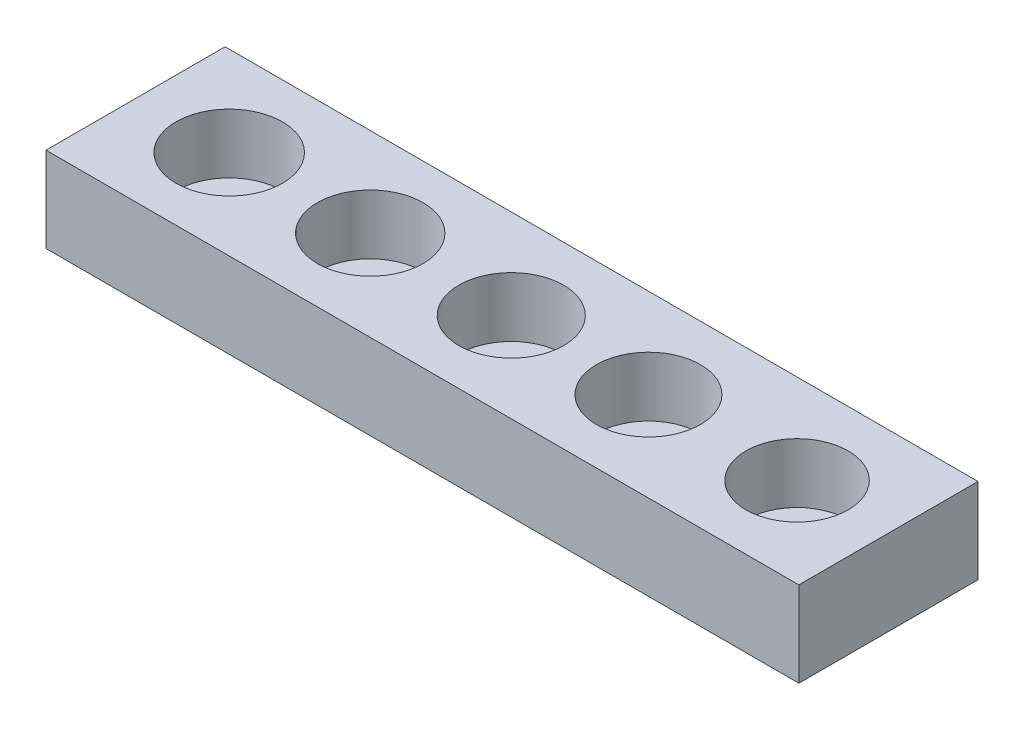
ISO-10303-21;
HEADER;
FILE_DESCRIPTION(('STEP AP214'),'2;1');
FILE_NAME('part.step','',(''),(''),'','','');
FILE_SCHEMA(('AUTOMOTIVE_DESIGN { 1 0 10303 214 1 1 1 1 }'));
ENDSEC;
DATA;
#1=APPLICATION_CONTEXT('core data for automotive mechanical design processes');
#2=APPLICATION_PROTOCOL_DEFINITION('international standard','automotive_design',2000,#1);
#3=PRODUCT_CONTEXT('',#1,'mechanical');
#4=PRODUCT('Part','Part','',(#3));
#5=PRODUCT_RELATED_PRODUCT_CATEGORY('part','',(#4));
#6=PRODUCT_DEFINITION_FORMATION('','',#4);
#7=PRODUCT_DEFINITION_CONTEXT('part definition',#1,'design');
#8=PRODUCT_DEFINITION('design','',#6,#7);
#9=PRODUCT_DEFINITION_SHAPE('','',#8);
#10=(LENGTH_UNIT() NAMED_UNIT(*) SI_UNIT(.MILLI.,.METRE.));
#11=(NAMED_UNIT(*) PLANE_ANGLE_UNIT() SI_UNIT($,.RADIAN.));
#12=(NAMED_UNIT(*) SI_UNIT($,.STERADIAN.) SOLID_ANGLE_UNIT());
#13=UNCERTAINTY_MEASURE_WITH_UNIT(LENGTH_MEASURE(1.E-05),#10,'distance_accuracy_value','');
#14=(GEOMETRIC_REPRESENTATION_CONTEXT(3) GLOBAL_UNCERTAINTY_ASSIGNED_CONTEXT((#13)) GLOBAL_UNIT_ASSIGNED_CONTEXT((#10,
#11,#12)) REPRESENTATION_CONTEXT('',''));
#15=CARTESIAN_POINT('',(0.,0.,0.));
#16=DIRECTION('',(0.,0.,1.));
#17=DIRECTION('',(1.,0.,0.));
#18=AXIS2_PLACEMENT_3D('',#15,#16,#17);
#19=CARTESIAN_POINT('',(-22.0918953244975,5.,-5.25584062481323));
#20=DIRECTION('',(0.,0.,-1.));
#21=DIRECTION('',(-1.,0.,0.));
#22=AXIS2_PLACEMENT_3D('',#19,#20,#21);
#23=PLANE('',#22);
#24=DIRECTION('',(1.,0.,0.));
#25=VECTOR('',#24,1.);
#26=CARTESIAN_POINT('',(-22.0918953244975,0.,-5.25584062481323));
#27=LINE('',#26,#25);
#28=CARTESIAN_POINT('',(-22.0918953244975,0.,-5.25584062481323));
#29=VERTEX_POINT('',#28);
#30=CARTESIAN_POINT('',(22.0918953244975,0.,-5.25584062481323));
#31=VERTEX_POINT('',#30);
#32=EDGE_CURVE('E116',#29,#31,#27,.T.);
#33=ORIENTED_EDGE('',*,*,#32,.F.);
#34=DIRECTION('',(0.,-1.,0.));
#35=VECTOR('',#34,1.);
#36=CARTESIAN_POINT('',(-22.0918953244975,5.,-5.25584062481323));
#37=LINE('',#36,#35);
#38=CARTESIAN_POINT('',(-22.0918953244975,5.,-5.25584062481323));
#39=VERTEX_POINT('',#38);
#40=EDGE_CURVE('E11',#39,#29,#37,.T.);
#41=ORIENTED_EDGE('',*,*,#40,.F.);
#42=DIRECTION('',(1.,0.,0.));
#43=VECTOR('',#42,1.);
#44=CARTESIAN_POINT('',(-22.0918953244975,5.,-5.25584062481323));
#45=LINE('',#44,#43);
#46=CARTESIAN_POINT('',(22.0918953244975,5.,-5.25584062481323));
#47=VERTEX_POINT('',#46);
#48=EDGE_CURVE('E107',#39,#47,#45,.T.);
#49=ORIENTED_EDGE('',*,*,#48,.T.);
#50=DIRECTION('',(0.,-1.,0.));
#51=VECTOR('',#50,1.);
#52=CARTESIAN_POINT('',(22.0918953244975,5.,-5.25584062481323));
#53=LINE('',#52,#51);
#54=EDGE_CURVE('E48',#47,#31,#53,.T.);
#55=ORIENTED_EDGE('',*,*,#54,.T.);
#56=EDGE_LOOP('',(#33,#41,#49,#55));
#57=FACE_BOUND('',#56,.T.);
#58=ADVANCED_FACE('F45',(#57),#23,.T.);
#59=CARTESIAN_POINT('',(-22.0918953244975,5.,5.25584062481323));
#60=DIRECTION('',(-1.,0.,0.));
#61=DIRECTION('',(0.,0.,1.));
#62=AXIS2_PLACEMENT_3D('',#59,#60,#61);
#63=PLANE('',#62);
#64=DIRECTION('',(0.,0.,-1.));
#65=VECTOR('',#64,1.);
#66=CARTESIAN_POINT('',(-22.0918953244975,0.,5.25584062481323));
#67=LINE('',#66,#65);
#68=CARTESIAN_POINT('',(-22.0918953244975,0.,5.25584062481323));
#69=VERTEX_POINT('',#68);
#70=EDGE_CURVE('E110',#69,#29,#67,.T.);
#71=ORIENTED_EDGE('',*,*,#70,.F.);
#72=DIRECTION('',(0.,-1.,0.));
#73=VECTOR('',#72,1.);
#74=CARTESIAN_POINT('',(-22.0918953244975,5.,5.25584062481323));
#75=LINE('',#74,#73);
#76=CARTESIAN_POINT('',(-22.0918953244975,5.,5.25584062481323));
#77=VERTEX_POINT('',#76);
#78=EDGE_CURVE('E55',#77,#69,#75,.T.);
#79=ORIENTED_EDGE('',*,*,#78,.F.);
#80=DIRECTION('',(0.,0.,-1.));
#81=VECTOR('',#80,1.);
#82=CARTESIAN_POINT('',(-22.0918953244975,5.,5.25584062481323));
#83=LINE('',#82,#81);
#84=EDGE_CURVE('E94',#77,#39,#83,.T.);
#85=ORIENTED_EDGE('',*,*,#84,.T.);
#86=ORIENTED_EDGE('',*,*,#40,.T.);
#87=EDGE_LOOP('',(#71,#79,#85,#86));
#88=FACE_BOUND('',#87,.T.);
#89=ADVANCED_FACE('F133',(#88),#63,.T.);
#90=CARTESIAN_POINT('',(-22.0918953244975,5.,5.25584062481323));
#91=DIRECTION('',(0.,0.,-1.));
#92=DIRECTION('',(-1.,0.,0.));
#93=AXIS2_PLACEMENT_3D('',#90,#91,#92);
#94=PLANE('',#93);
#95=DIRECTION('',(1.,0.,0.));
#96=VECTOR('',#95,1.);
#97=CARTESIAN_POINT('',(-22.0918953244975,0.,5.25584062481323));
#98=LINE('',#97,#96);
#99=CARTESIAN_POINT('',(22.0918953244975,0.,5.25584062481323));
#100=VERTEX_POINT('',#99);
#101=EDGE_CURVE('E100',#69,#100,#98,.T.);
#102=ORIENTED_EDGE('',*,*,#101,.T.);
#103=DIRECTION('',(0.,-1.,0.));
#104=VECTOR('',#103,1.);
#105=CARTESIAN_POINT('',(22.0918953244975,5.,5.25584062481323));
#106=LINE('',#105,#104);
#107=CARTESIAN_POINT('',(22.0918953244975,5.,5.25584062481323));
#108=VERTEX_POINT('',#107);
#109=EDGE_CURVE('E98',#108,#100,#106,.T.);
#110=ORIENTED_EDGE('',*,*,#109,.F.);
#111=DIRECTION('',(1.,0.,0.));
#112=VECTOR('',#111,1.);
#113=CARTESIAN_POINT('',(-22.0918953244975,5.,5.25584062481323));
#114=LINE('',#113,#112);
#115=EDGE_CURVE('E91',#77,#108,#114,.T.);
#116=ORIENTED_EDGE('',*,*,#115,.F.);
#117=ORIENTED_EDGE('',*,*,#78,.T.);
#118=EDGE_LOOP('',(#102,#110,#116,#117));
#119=FACE_BOUND('',#118,.T.);
#120=ADVANCED_FACE('F99',(#119),#94,.F.);
#121=CARTESIAN_POINT('',(22.0918953244975,5.,5.25584062481323));
#122=DIRECTION('',(-1.,0.,0.));
#123=DIRECTION('',(0.,0.,1.));
#124=AXIS2_PLACEMENT_3D('',#121,#122,#123);
#125=PLANE('',#124);
#126=DIRECTION('',(0.,0.,-1.));
#127=VECTOR('',#126,1.);
#128=CARTESIAN_POINT('',(22.0918953244975,0.,5.25584062481323));
#129=LINE('',#128,#127);
#130=EDGE_CURVE('E120',#100,#31,#129,.T.);
#131=ORIENTED_EDGE('',*,*,#130,.T.);
#132=ORIENTED_EDGE('',*,*,#54,.F.);
#133=DIRECTION('',(0.,0.,-1.));
#134=VECTOR('',#133,1.);
#135=CARTESIAN_POINT('',(22.0918953244975,5.,5.25584062481323));
#136=LINE('',#135,#134);
#137=EDGE_CURVE('E88',#108,#47,#136,.T.);
#138=ORIENTED_EDGE('',*,*,#137,.F.);
#139=ORIENTED_EDGE('',*,*,#109,.T.);
#140=EDGE_LOOP('',(#131,#132,#138,#139));
#141=FACE_BOUND('',#140,.T.);
#142=ADVANCED_FACE('F105',(#141),#125,.F.);
#143=CARTESIAN_POINT('',(0.,5.,0.));
#144=DIRECTION('',(0.,1.,0.));
#145=DIRECTION('',(0.,0.,1.));
#146=AXIS2_PLACEMENT_3D('',#143,#144,#145);
#147=PLANE('',#146);
#148=CARTESIAN_POINT('',(-16.5953893403899,5.,0.));
#149=DIRECTION('',(0.,1.,0.));
#150=DIRECTION('',(0.,0.,1.));
#151=AXIS2_PLACEMENT_3D('',#148,#149,#150);
#152=CIRCLE('',#151,3.125);
#153=CARTESIAN_POINT('',(-16.5953893403899,5.,3.125));
#154=VERTEX_POINT('',#153);
#155=EDGE_CURVE('E198',#154,#154,#152,.T.);
#156=ORIENTED_EDGE('',*,*,#155,.F.);
#157=EDGE_LOOP('',(#156));
#158=FACE_BOUND('',#157,.T.);
#159=CARTESIAN_POINT('',(-8.36374721634367,5.,-0.0444880171082105));
#160=DIRECTION('',(0.,1.,0.));
#161=DIRECTION('',(0.,0.,1.));
#162=AXIS2_PLACEMENT_3D('',#159,#160,#161);
#163=CIRCLE('',#162,3.1);
#164=CARTESIAN_POINT('',(-8.36374721634367,5.,3.05551198289179));
#165=VERTEX_POINT('',#164);
#166=EDGE_CURVE('E202',#165,#165,#163,.T.);
#167=ORIENTED_EDGE('',*,*,#166,.F.);
#168=EDGE_LOOP('',(#167));
#169=FACE_BOUND('',#168,.T.);
#170=CARTESIAN_POINT('',(-0.044488017108206,5.,0.));
#171=DIRECTION('',(0.,1.,0.));
#172=DIRECTION('',(0.,0.,1.));
#173=AXIS2_PLACEMENT_3D('',#170,#171,#172);
#174=CIRCLE('',#173,3.075);
#175=CARTESIAN_POINT('',(-0.044488017108206,5.,3.075));
#176=VERTEX_POINT('',#175);
#177=EDGE_CURVE('E212',#176,#176,#174,.T.);
#178=ORIENTED_EDGE('',*,*,#177,.F.);
#179=EDGE_LOOP('',(#178));
#180=FACE_BOUND('',#179,.T.);
#181=CARTESIAN_POINT('',(8.00784307947799,5.,0.));
#182=DIRECTION('',(0.,1.,0.));
#183=DIRECTION('',(0.,0.,1.));
#184=AXIS2_PLACEMENT_3D('',#181,#182,#183);
#185=CIRCLE('',#184,3.05);
#186=CARTESIAN_POINT('',(8.00784307947799,5.,3.05));
#187=VERTEX_POINT('',#186);
#188=EDGE_CURVE('E220',#187,#187,#185,.T.);
#189=ORIENTED_EDGE('',*,*,#188,.F.);
#190=EDGE_LOOP('',(#189));
#191=FACE_BOUND('',#190,.T.);
#192=CARTESIAN_POINT('',(16.7274944326873,5.,0.));
#193=DIRECTION('',(0.,1.,0.));
#194=DIRECTION('',(0.,0.,1.));
#195=AXIS2_PLACEMENT_3D('',#192,#193,#194);
#196=CIRCLE('',#195,3.);
#197=CARTESIAN_POINT('',(16.7274944326873,5.,3.));
#198=VERTEX_POINT('',#197);
#199=EDGE_CURVE('E228',#198,#198,#196,.T.);
#200=ORIENTED_EDGE('',*,*,#199,.F.);
#201=EDGE_LOOP('',(#200));
#202=FACE_BOUND('',#201,.T.);
#203=ORIENTED_EDGE('',*,*,#48,.F.);
#204=ORIENTED_EDGE('',*,*,#84,.F.);
#205=ORIENTED_EDGE('',*,*,#115,.T.);
#206=ORIENTED_EDGE('',*,*,#137,.T.);
#207=EDGE_LOOP('',(#203,#204,#205,#206));
#208=FACE_BOUND('',#207,.T.);
#209=ADVANCED_FACE('F93',(#158,#169,#180,#191,#202,#208),#147,.T.);
#210=CARTESIAN_POINT('',(0.,0.,0.));
#211=DIRECTION('',(0.,1.,0.));
#212=DIRECTION('',(0.,0.,1.));
#213=AXIS2_PLACEMENT_3D('',#210,#211,#212);
#214=PLANE('',#213);
#215=ORIENTED_EDGE('',*,*,#32,.T.);
#216=ORIENTED_EDGE('',*,*,#130,.F.);
#217=ORIENTED_EDGE('',*,*,#101,.F.);
#218=ORIENTED_EDGE('',*,*,#70,.T.);
#219=EDGE_LOOP('',(#215,#216,#217,#218));
#220=FACE_BOUND('',#219,.T.);
#221=ADVANCED_FACE('F132',(#220),#214,.F.);
#222=CARTESIAN_POINT('',(16.7274944326873,1.5,0.));
#223=DIRECTION('',(0.,1.,0.));
#224=DIRECTION('',(0.,0.,1.));
#225=AXIS2_PLACEMENT_3D('',#222,#223,#224);
#226=CYLINDRICAL_SURFACE('',#225,3.);
#227=CARTESIAN_POINT('',(16.7274944326873,1.5,0.));
#228=DIRECTION('',(0.,1.,0.));
#229=DIRECTION('',(0.,0.,1.));
#230=AXIS2_PLACEMENT_3D('',#227,#228,#229);
#231=CIRCLE('',#230,3.);
#232=CARTESIAN_POINT('',(16.7274944326873,1.5,3.));
#233=VERTEX_POINT('',#232);
#234=EDGE_CURVE('E231',#233,#233,#231,.T.);
#235=ORIENTED_EDGE('',*,*,#234,.F.);
#236=EDGE_LOOP('',(#235));
#237=FACE_BOUND('',#236,.T.);
#238=ORIENTED_EDGE('',*,*,#199,.T.);
#239=EDGE_LOOP('',(#238));
#240=FACE_BOUND('',#239,.T.);
#241=ADVANCED_FACE('F152',(#237,#240),#226,.F.);
#242=CARTESIAN_POINT('',(16.7274944326873,1.5,0.));
#243=DIRECTION('',(0.,1.,0.));
#244=DIRECTION('',(0.,0.,1.));
#245=AXIS2_PLACEMENT_3D('',#242,#243,#244);
#246=PLANE('',#245);
#247=ORIENTED_EDGE('',*,*,#234,.T.);
#248=EDGE_LOOP('',(#247));
#249=FACE_BOUND('',#248,.T.);
#250=ADVANCED_FACE('F156',(#249),#246,.T.);
#251=CARTESIAN_POINT('',(8.00784307947799,1.5,0.));
#252=DIRECTION('',(0.,1.,0.));
#253=DIRECTION('',(0.,0.,1.));
#254=AXIS2_PLACEMENT_3D('',#251,#252,#253);
#255=CYLINDRICAL_SURFACE('',#254,3.05);
#256=CARTESIAN_POINT('',(8.00784307947799,1.5,0.));
#257=DIRECTION('',(0.,1.,0.));
#258=DIRECTION('',(0.,0.,1.));
#259=AXIS2_PLACEMENT_3D('',#256,#257,#258);
#260=CIRCLE('',#259,3.05);
#261=CARTESIAN_POINT('',(8.00784307947799,1.5,3.05));
#262=VERTEX_POINT('',#261);
#263=EDGE_CURVE('E224',#262,#262,#260,.T.);
#264=ORIENTED_EDGE('',*,*,#263,.F.);
#265=EDGE_LOOP('',(#264));
#266=FACE_BOUND('',#265,.T.);
#267=ORIENTED_EDGE('',*,*,#188,.T.);
#268=EDGE_LOOP('',(#267));
#269=FACE_BOUND('',#268,.T.);
#270=ADVANCED_FACE('F159',(#266,#269),#255,.F.);
#271=CARTESIAN_POINT('',(8.00784307947799,1.5,0.));
#272=DIRECTION('',(0.,1.,0.));
#273=DIRECTION('',(0.,0.,1.));
#274=AXIS2_PLACEMENT_3D('',#271,#272,#273);
#275=PLANE('',#274);
#276=ORIENTED_EDGE('',*,*,#263,.T.);
#277=EDGE_LOOP('',(#276));
#278=FACE_BOUND('',#277,.T.);
#279=ADVANCED_FACE('F163',(#278),#275,.T.);
#280=CARTESIAN_POINT('',(-0.044488017108206,1.5,0.));
#281=DIRECTION('',(0.,1.,0.));
#282=DIRECTION('',(0.,0.,1.));
#283=AXIS2_PLACEMENT_3D('',#280,#281,#282);
#284=CYLINDRICAL_SURFACE('',#283,3.075);
#285=CARTESIAN_POINT('',(-0.044488017108206,1.5,0.));
#286=DIRECTION('',(0.,1.,0.));
#287=DIRECTION('',(0.,0.,1.));
#288=AXIS2_PLACEMENT_3D('',#285,#286,#287);
#289=CIRCLE('',#288,3.075);
#290=CARTESIAN_POINT('',(-0.044488017108206,1.5,3.075));
#291=VERTEX_POINT('',#290);
#292=EDGE_CURVE('E216',#291,#291,#289,.T.);
#293=ORIENTED_EDGE('',*,*,#292,.F.);
#294=EDGE_LOOP('',(#293));
#295=FACE_BOUND('',#294,.T.);
#296=ORIENTED_EDGE('',*,*,#177,.T.);
#297=EDGE_LOOP('',(#296));
#298=FACE_BOUND('',#297,.T.);
#299=ADVANCED_FACE('F166',(#295,#298),#284,.F.);
#300=CARTESIAN_POINT('',(-0.044488017108206,1.5,0.));
#301=DIRECTION('',(0.,1.,0.));
#302=DIRECTION('',(0.,0.,1.));
#303=AXIS2_PLACEMENT_3D('',#300,#301,#302);
#304=PLANE('',#303);
#305=ORIENTED_EDGE('',*,*,#292,.T.);
#306=EDGE_LOOP('',(#305));
#307=FACE_BOUND('',#306,.T.);
#308=ADVANCED_FACE('F171',(#307),#304,.T.);
#309=CARTESIAN_POINT('',(-8.36374721634367,1.5,-0.0444880171082105));
#310=DIRECTION('',(0.,1.,0.));
#311=DIRECTION('',(0.,0.,1.));
#312=AXIS2_PLACEMENT_3D('',#309,#310,#311);
#313=CYLINDRICAL_SURFACE('',#312,3.1);
#314=CARTESIAN_POINT('',(-8.36374721634367,1.5,-0.0444880171082105));
#315=DIRECTION('',(0.,1.,0.));
#316=DIRECTION('',(0.,0.,1.));
#317=AXIS2_PLACEMENT_3D('',#314,#315,#316);
#318=CIRCLE('',#317,3.1);
#319=CARTESIAN_POINT('',(-8.36374721634367,1.5,3.05551198289179));
#320=VERTEX_POINT('',#319);
#321=EDGE_CURVE('E208',#320,#320,#318,.T.);
#322=ORIENTED_EDGE('',*,*,#321,.F.);
#323=EDGE_LOOP('',(#322));
#324=FACE_BOUND('',#323,.T.);
#325=ORIENTED_EDGE('',*,*,#166,.T.);
#326=EDGE_LOOP('',(#325));
#327=FACE_BOUND('',#326,.T.);
#328=ADVANCED_FACE('F174',(#324,#327),#313,.F.);
#329=CARTESIAN_POINT('',(-8.36374721634367,1.5,-0.0444880171082105));
#330=DIRECTION('',(0.,1.,0.));
#331=DIRECTION('',(0.,0.,1.));
#332=AXIS2_PLACEMENT_3D('',#329,#330,#331);
#333=PLANE('',#332);
#334=ORIENTED_EDGE('',*,*,#321,.T.);
#335=EDGE_LOOP('',(#334));
#336=FACE_BOUND('',#335,.T.);
#337=ADVANCED_FACE('F179',(#336),#333,.T.);
#338=CARTESIAN_POINT('',(-16.5953893403899,1.5,0.));
#339=DIRECTION('',(0.,1.,0.));
#340=DIRECTION('',(0.,0.,1.));
#341=AXIS2_PLACEMENT_3D('',#338,#339,#340);
#342=CYLINDRICAL_SURFACE('',#341,3.125);
#343=CARTESIAN_POINT('',(-16.5953893403899,1.5,0.));
#344=DIRECTION('',(0.,1.,0.));
#345=DIRECTION('',(0.,0.,1.));
#346=AXIS2_PLACEMENT_3D('',#343,#344,#345);
#347=CIRCLE('',#346,3.125);
#348=CARTESIAN_POINT('',(-16.5953893403899,1.5,3.125));
#349=VERTEX_POINT('',#348);
#350=EDGE_CURVE('E121',#349,#349,#347,.T.);
#351=ORIENTED_EDGE('',*,*,#350,.F.);
#352=EDGE_LOOP('',(#351));
#353=FACE_BOUND('',#352,.T.);
#354=ORIENTED_EDGE('',*,*,#155,.T.);
#355=EDGE_LOOP('',(#354));
#356=FACE_BOUND('',#355,.T.);
#357=ADVANCED_FACE('F182',(#353,#356),#342,.F.);
#358=CARTESIAN_POINT('',(-16.5953893403899,1.5,0.));
#359=DIRECTION('',(0.,1.,0.));
#360=DIRECTION('',(0.,0.,1.));
#361=AXIS2_PLACEMENT_3D('',#358,#359,#360);
#362=PLANE('',#361);
#363=ORIENTED_EDGE('',*,*,#350,.T.);
#364=EDGE_LOOP('',(#363));
#365=FACE_BOUND('',#364,.T.);
#366=ADVANCED_FACE('F189',(#365),#362,.T.);
#367=CLOSED_SHELL('',(#58,#89,#120,#142,#209,#221,#241,#250,#270,#279,#299,#308,#328,#337,#357,#366));
#368=MANIFOLD_SOLID_BREP('B2',#367);
#369=ADVANCED_BREP_SHAPE_REPRESENTATION('',(#18,#368),#14);
#370=SHAPE_DEFINITION_REPRESENTATION(#9,#369);
ENDSEC;
END-ISO-10303-21;
